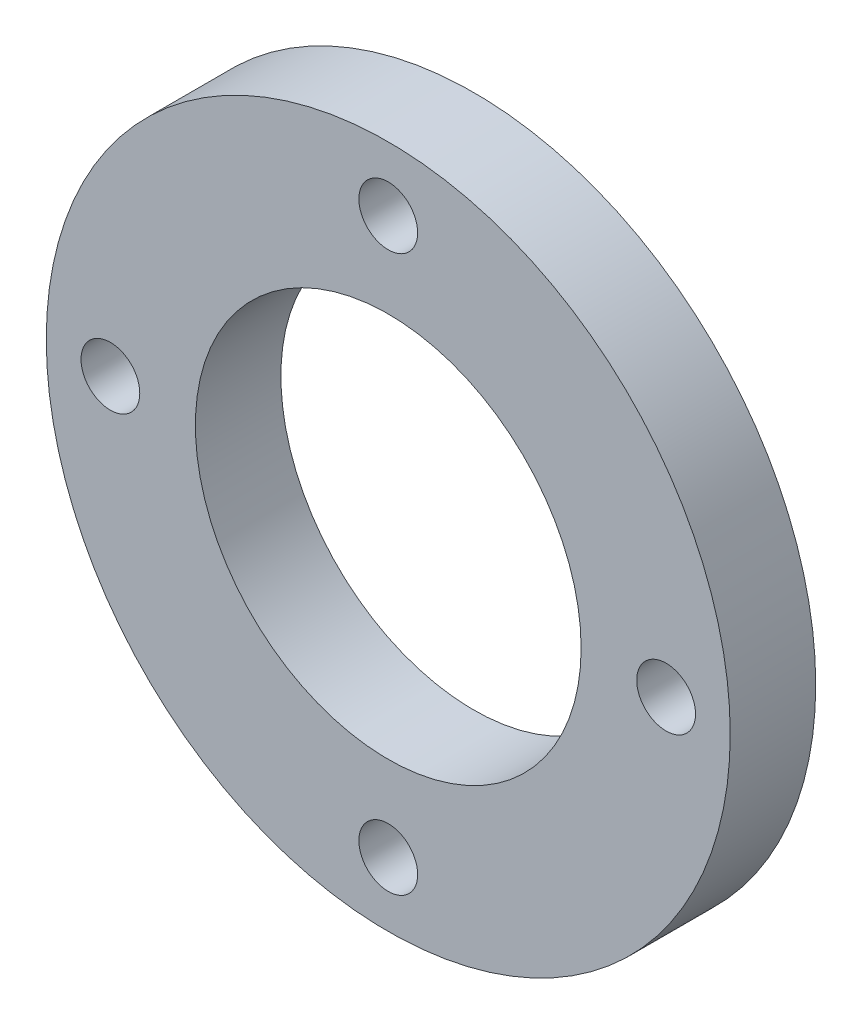
ISO-10303-21;
HEADER;
FILE_DESCRIPTION(('STEP AP214'),'2;1');
FILE_NAME('part.step','',(''),(''),'','','');
FILE_SCHEMA(('AUTOMOTIVE_DESIGN { 1 0 10303 214 1 1 1 1 }'));
ENDSEC;
DATA;
#1=APPLICATION_CONTEXT('core data for automotive mechanical design processes');
#2=APPLICATION_PROTOCOL_DEFINITION('international standard','automotive_design',2000,#1);
#3=PRODUCT_CONTEXT('',#1,'mechanical');
#4=PRODUCT('Part','Part','',(#3));
#5=PRODUCT_RELATED_PRODUCT_CATEGORY('part','',(#4));
#6=PRODUCT_DEFINITION_FORMATION('','',#4);
#7=PRODUCT_DEFINITION_CONTEXT('part definition',#1,'design');
#8=PRODUCT_DEFINITION('design','',#6,#7);
#9=PRODUCT_DEFINITION_SHAPE('','',#8);
#10=(LENGTH_UNIT() NAMED_UNIT(*) SI_UNIT(.MILLI.,.METRE.));
#11=(NAMED_UNIT(*) PLANE_ANGLE_UNIT() SI_UNIT($,.RADIAN.));
#12=(NAMED_UNIT(*) SI_UNIT($,.STERADIAN.) SOLID_ANGLE_UNIT());
#13=UNCERTAINTY_MEASURE_WITH_UNIT(LENGTH_MEASURE(1.E-05),#10,'distance_accuracy_value','');
#14=(GEOMETRIC_REPRESENTATION_CONTEXT(3) GLOBAL_UNCERTAINTY_ASSIGNED_CONTEXT((#13)) GLOBAL_UNIT_ASSIGNED_CONTEXT((#10,
#11,#12)) REPRESENTATION_CONTEXT('',''));
#15=CARTESIAN_POINT('',(0.,0.,0.));
#16=DIRECTION('',(0.,0.,1.));
#17=DIRECTION('',(1.,0.,0.));
#18=AXIS2_PLACEMENT_3D('',#15,#16,#17);
#19=CARTESIAN_POINT('',(0.,0.,12.7));
#20=DIRECTION('',(0.,0.,1.));
#21=DIRECTION('',(1.,0.,0.));
#22=AXIS2_PLACEMENT_3D('',#19,#20,#21);
#23=PLANE('',#22);
#24=CARTESIAN_POINT('',(0.,-41.275,12.7));
#25=DIRECTION('',(0.,0.,1.));
#26=DIRECTION('',(1.,0.,0.));
#27=AXIS2_PLACEMENT_3D('',#24,#25,#26);
#28=CIRCLE('',#27,4.365625);
#29=CARTESIAN_POINT('',(4.36562500000001,-41.275,12.7));
#30=VERTEX_POINT('',#29);
#31=EDGE_CURVE('E58',#30,#30,#28,.T.);
#32=ORIENTED_EDGE('',*,*,#31,.F.);
#33=EDGE_LOOP('',(#32));
#34=FACE_BOUND('',#33,.T.);
#35=CARTESIAN_POINT('',(0.,41.275,12.7));
#36=DIRECTION('',(0.,0.,1.));
#37=DIRECTION('',(1.,0.,0.));
#38=AXIS2_PLACEMENT_3D('',#35,#36,#37);
#39=CIRCLE('',#38,4.365625);
#40=CARTESIAN_POINT('',(4.36562500000001,41.275,12.7));
#41=VERTEX_POINT('',#40);
#42=EDGE_CURVE('E46',#41,#41,#39,.T.);
#43=ORIENTED_EDGE('',*,*,#42,.F.);
#44=EDGE_LOOP('',(#43));
#45=FACE_BOUND('',#44,.T.);
#46=CARTESIAN_POINT('',(0.,0.,12.7));
#47=DIRECTION('',(0.,0.,1.));
#48=DIRECTION('',(1.,0.,0.));
#49=AXIS2_PLACEMENT_3D('',#46,#47,#48);
#50=CIRCLE('',#49,50.8);
#51=CARTESIAN_POINT('',(50.8,0.,12.7));
#52=VERTEX_POINT('',#51);
#53=EDGE_CURVE('E10',#52,#52,#50,.T.);
#54=ORIENTED_EDGE('',*,*,#53,.T.);
#55=EDGE_LOOP('',(#54));
#56=FACE_BOUND('',#55,.T.);
#57=CARTESIAN_POINT('',(0.,0.,12.7));
#58=DIRECTION('',(0.,0.,1.));
#59=DIRECTION('',(1.,0.,0.));
#60=AXIS2_PLACEMENT_3D('',#57,#58,#59);
#61=CIRCLE('',#60,28.6512);
#62=CARTESIAN_POINT('',(28.6512,0.,12.7));
#63=VERTEX_POINT('',#62);
#64=EDGE_CURVE('E41',#63,#63,#61,.T.);
#65=ORIENTED_EDGE('',*,*,#64,.F.);
#66=EDGE_LOOP('',(#65));
#67=FACE_BOUND('',#66,.T.);
#68=CARTESIAN_POINT('',(41.275,0.,12.7));
#69=DIRECTION('',(0.,0.,1.));
#70=DIRECTION('',(1.,0.,0.));
#71=AXIS2_PLACEMENT_3D('',#68,#69,#70);
#72=CIRCLE('',#71,4.365625);
#73=CARTESIAN_POINT('',(45.640625,0.,12.7));
#74=VERTEX_POINT('',#73);
#75=EDGE_CURVE('E52',#74,#74,#72,.T.);
#76=ORIENTED_EDGE('',*,*,#75,.F.);
#77=EDGE_LOOP('',(#76));
#78=FACE_BOUND('',#77,.T.);
#79=CARTESIAN_POINT('',(-41.275,0.,12.7));
#80=DIRECTION('',(0.,0.,1.));
#81=DIRECTION('',(1.,0.,0.));
#82=AXIS2_PLACEMENT_3D('',#79,#80,#81);
#83=CIRCLE('',#82,4.365625);
#84=CARTESIAN_POINT('',(-36.909375,0.,12.7));
#85=VERTEX_POINT('',#84);
#86=EDGE_CURVE('E64',#85,#85,#83,.T.);
#87=ORIENTED_EDGE('',*,*,#86,.F.);
#88=EDGE_LOOP('',(#87));
#89=FACE_BOUND('',#88,.T.);
#90=ADVANCED_FACE('F30',(#34,#45,#56,#67,#78,#89),#23,.T.);
#91=CARTESIAN_POINT('',(0.,0.,0.));
#92=DIRECTION('',(0.,0.,1.));
#93=DIRECTION('',(1.,0.,0.));
#94=AXIS2_PLACEMENT_3D('',#91,#92,#93);
#95=PLANE('',#94);
#96=CARTESIAN_POINT('',(0.,0.,0.));
#97=DIRECTION('',(0.,0.,1.));
#98=DIRECTION('',(1.,0.,0.));
#99=AXIS2_PLACEMENT_3D('',#96,#97,#98);
#100=CIRCLE('',#99,50.8);
#101=CARTESIAN_POINT('',(50.8,0.,0.));
#102=VERTEX_POINT('',#101);
#103=EDGE_CURVE('E34',#102,#102,#100,.T.);
#104=ORIENTED_EDGE('',*,*,#103,.F.);
#105=EDGE_LOOP('',(#104));
#106=FACE_BOUND('',#105,.T.);
#107=CARTESIAN_POINT('',(0.,0.,0.));
#108=DIRECTION('',(0.,0.,1.));
#109=DIRECTION('',(1.,0.,0.));
#110=AXIS2_PLACEMENT_3D('',#107,#108,#109);
#111=CIRCLE('',#110,28.6512);
#112=CARTESIAN_POINT('',(28.6512,0.,0.));
#113=VERTEX_POINT('',#112);
#114=EDGE_CURVE('E43',#113,#113,#111,.T.);
#115=ORIENTED_EDGE('',*,*,#114,.T.);
#116=EDGE_LOOP('',(#115));
#117=FACE_BOUND('',#116,.T.);
#118=CARTESIAN_POINT('',(0.,41.275,0.));
#119=DIRECTION('',(0.,0.,1.));
#120=DIRECTION('',(1.,0.,0.));
#121=AXIS2_PLACEMENT_3D('',#118,#119,#120);
#122=CIRCLE('',#121,4.365625);
#123=CARTESIAN_POINT('',(4.36562500000001,41.275,0.));
#124=VERTEX_POINT('',#123);
#125=EDGE_CURVE('E49',#124,#124,#122,.T.);
#126=ORIENTED_EDGE('',*,*,#125,.T.);
#127=EDGE_LOOP('',(#126));
#128=FACE_BOUND('',#127,.T.);
#129=CARTESIAN_POINT('',(41.275,0.,0.));
#130=DIRECTION('',(0.,0.,1.));
#131=DIRECTION('',(1.,0.,0.));
#132=AXIS2_PLACEMENT_3D('',#129,#130,#131);
#133=CIRCLE('',#132,4.365625);
#134=CARTESIAN_POINT('',(45.640625,0.,0.));
#135=VERTEX_POINT('',#134);
#136=EDGE_CURVE('E55',#135,#135,#133,.T.);
#137=ORIENTED_EDGE('',*,*,#136,.T.);
#138=EDGE_LOOP('',(#137));
#139=FACE_BOUND('',#138,.T.);
#140=CARTESIAN_POINT('',(0.,-41.275,0.));
#141=DIRECTION('',(0.,0.,1.));
#142=DIRECTION('',(1.,0.,0.));
#143=AXIS2_PLACEMENT_3D('',#140,#141,#142);
#144=CIRCLE('',#143,4.365625);
#145=CARTESIAN_POINT('',(4.36562500000001,-41.275,0.));
#146=VERTEX_POINT('',#145);
#147=EDGE_CURVE('E61',#146,#146,#144,.T.);
#148=ORIENTED_EDGE('',*,*,#147,.T.);
#149=EDGE_LOOP('',(#148));
#150=FACE_BOUND('',#149,.T.);
#151=CARTESIAN_POINT('',(-41.275,0.,0.));
#152=DIRECTION('',(0.,0.,1.));
#153=DIRECTION('',(1.,0.,0.));
#154=AXIS2_PLACEMENT_3D('',#151,#152,#153);
#155=CIRCLE('',#154,4.365625);
#156=CARTESIAN_POINT('',(-36.909375,0.,0.));
#157=VERTEX_POINT('',#156);
#158=EDGE_CURVE('E67',#157,#157,#155,.T.);
#159=ORIENTED_EDGE('',*,*,#158,.T.);
#160=EDGE_LOOP('',(#159));
#161=FACE_BOUND('',#160,.T.);
#162=ADVANCED_FACE('F77',(#106,#117,#128,#139,#150,#161),#95,.F.);
#163=CARTESIAN_POINT('',(0.,0.,12.7));
#164=DIRECTION('',(0.,0.,-1.));
#165=DIRECTION('',(-1.,0.,0.));
#166=AXIS2_PLACEMENT_3D('',#163,#164,#165);
#167=CYLINDRICAL_SURFACE('',#166,50.8);
#168=ORIENTED_EDGE('',*,*,#53,.F.);
#169=EDGE_LOOP('',(#168));
#170=FACE_BOUND('',#169,.T.);
#171=ORIENTED_EDGE('',*,*,#103,.T.);
#172=EDGE_LOOP('',(#171));
#173=FACE_BOUND('',#172,.T.);
#174=ADVANCED_FACE('F32',(#170,#173),#167,.T.);
#175=CARTESIAN_POINT('',(0.,0.,12.7));
#176=DIRECTION('',(0.,0.,-1.));
#177=DIRECTION('',(-1.,0.,0.));
#178=AXIS2_PLACEMENT_3D('',#175,#176,#177);
#179=CYLINDRICAL_SURFACE('',#178,28.6512);
#180=ORIENTED_EDGE('',*,*,#64,.T.);
#181=EDGE_LOOP('',(#180));
#182=FACE_BOUND('',#181,.T.);
#183=ORIENTED_EDGE('',*,*,#114,.F.);
#184=EDGE_LOOP('',(#183));
#185=FACE_BOUND('',#184,.T.);
#186=ADVANCED_FACE('F87',(#182,#185),#179,.F.);
#187=CARTESIAN_POINT('',(0.,41.275,12.7));
#188=DIRECTION('',(0.,0.,-1.));
#189=DIRECTION('',(-1.,0.,0.));
#190=AXIS2_PLACEMENT_3D('',#187,#188,#189);
#191=CYLINDRICAL_SURFACE('',#190,4.365625);
#192=ORIENTED_EDGE('',*,*,#42,.T.);
#193=EDGE_LOOP('',(#192));
#194=FACE_BOUND('',#193,.T.);
#195=ORIENTED_EDGE('',*,*,#125,.F.);
#196=EDGE_LOOP('',(#195));
#197=FACE_BOUND('',#196,.T.);
#198=ADVANCED_FACE('F90',(#194,#197),#191,.F.);
#199=CARTESIAN_POINT('',(41.275,0.,12.7));
#200=DIRECTION('',(0.,0.,-1.));
#201=DIRECTION('',(-1.,0.,0.));
#202=AXIS2_PLACEMENT_3D('',#199,#200,#201);
#203=CYLINDRICAL_SURFACE('',#202,4.365625);
#204=ORIENTED_EDGE('',*,*,#75,.T.);
#205=EDGE_LOOP('',(#204));
#206=FACE_BOUND('',#205,.T.);
#207=ORIENTED_EDGE('',*,*,#136,.F.);
#208=EDGE_LOOP('',(#207));
#209=FACE_BOUND('',#208,.T.);
#210=ADVANCED_FACE('F94',(#206,#209),#203,.F.);
#211=CARTESIAN_POINT('',(0.,-41.275,12.7));
#212=DIRECTION('',(0.,0.,-1.));
#213=DIRECTION('',(-1.,0.,0.));
#214=AXIS2_PLACEMENT_3D('',#211,#212,#213);
#215=CYLINDRICAL_SURFACE('',#214,4.365625);
#216=ORIENTED_EDGE('',*,*,#31,.T.);
#217=EDGE_LOOP('',(#216));
#218=FACE_BOUND('',#217,.T.);
#219=ORIENTED_EDGE('',*,*,#147,.F.);
#220=EDGE_LOOP('',(#219));
#221=FACE_BOUND('',#220,.T.);
#222=ADVANCED_FACE('F98',(#218,#221),#215,.F.);
#223=CARTESIAN_POINT('',(-41.275,0.,12.7));
#224=DIRECTION('',(0.,0.,-1.));
#225=DIRECTION('',(-1.,0.,0.));
#226=AXIS2_PLACEMENT_3D('',#223,#224,#225);
#227=CYLINDRICAL_SURFACE('',#226,4.365625);
#228=ORIENTED_EDGE('',*,*,#86,.T.);
#229=EDGE_LOOP('',(#228));
#230=FACE_BOUND('',#229,.T.);
#231=ORIENTED_EDGE('',*,*,#158,.F.);
#232=EDGE_LOOP('',(#231));
#233=FACE_BOUND('',#232,.T.);
#234=ADVANCED_FACE('F73',(#230,#233),#227,.F.);
#235=CLOSED_SHELL('',(#90,#162,#174,#186,#198,#210,#222,#234));
#236=MANIFOLD_SOLID_BREP('B2',#235);
#237=ADVANCED_BREP_SHAPE_REPRESENTATION('',(#18,#236),#14);
#238=SHAPE_DEFINITION_REPRESENTATION(#9,#237);
ENDSEC;
END-ISO-10303-21;
